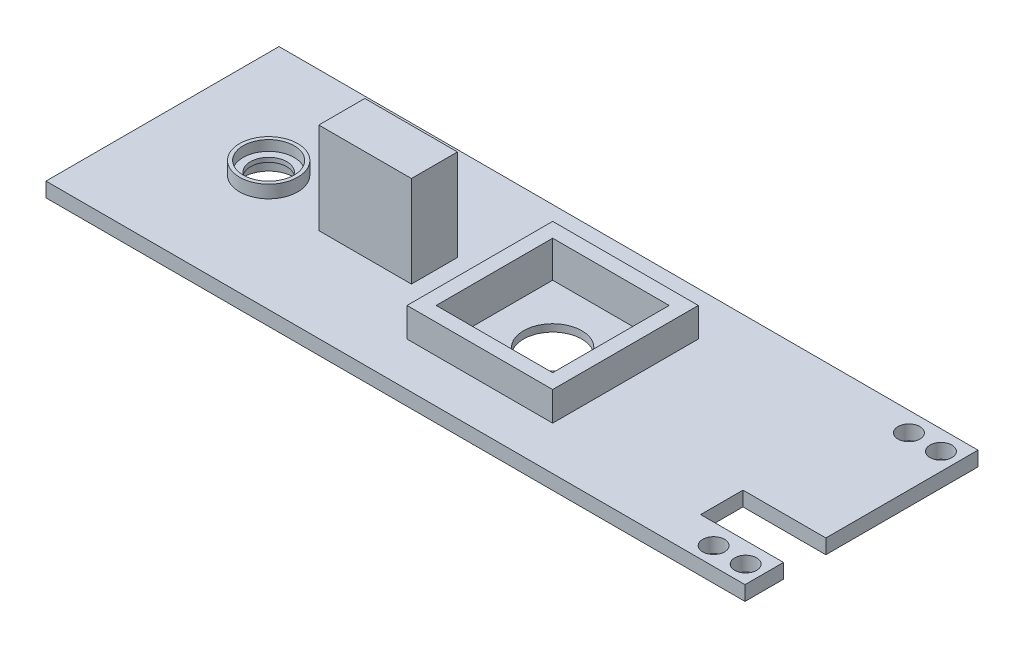
ISO-10303-21;
HEADER;
FILE_DESCRIPTION(('STEP AP214'),'2;1');
FILE_NAME('part.step','',(''),(''),'','','');
FILE_SCHEMA(('AUTOMOTIVE_DESIGN { 1 0 10303 214 1 1 1 1 }'));
ENDSEC;
DATA;
#1=APPLICATION_CONTEXT('core data for automotive mechanical design processes');
#2=APPLICATION_PROTOCOL_DEFINITION('international standard','automotive_design',2000,#1);
#3=PRODUCT_CONTEXT('',#1,'mechanical');
#4=PRODUCT('Part','Part','',(#3));
#5=PRODUCT_RELATED_PRODUCT_CATEGORY('part','',(#4));
#6=PRODUCT_DEFINITION_FORMATION('','',#4);
#7=PRODUCT_DEFINITION_CONTEXT('part definition',#1,'design');
#8=PRODUCT_DEFINITION('design','',#6,#7);
#9=PRODUCT_DEFINITION_SHAPE('','',#8);
#10=(LENGTH_UNIT() NAMED_UNIT(*) SI_UNIT(.MILLI.,.METRE.));
#11=(NAMED_UNIT(*) PLANE_ANGLE_UNIT() SI_UNIT($,.RADIAN.));
#12=(NAMED_UNIT(*) SI_UNIT($,.STERADIAN.) SOLID_ANGLE_UNIT());
#13=UNCERTAINTY_MEASURE_WITH_UNIT(LENGTH_MEASURE(1.E-05),#10,'distance_accuracy_value','');
#14=(GEOMETRIC_REPRESENTATION_CONTEXT(3) GLOBAL_UNCERTAINTY_ASSIGNED_CONTEXT((#13)) GLOBAL_UNIT_ASSIGNED_CONTEXT((#10,
#11,#12)) REPRESENTATION_CONTEXT('',''));
#15=CARTESIAN_POINT('',(0.,0.,0.));
#16=DIRECTION('',(0.,0.,1.));
#17=DIRECTION('',(1.,0.,0.));
#18=AXIS2_PLACEMENT_3D('',#15,#16,#17);
#19=CARTESIAN_POINT('',(0.,6.35,50.8));
#20=DIRECTION('',(-1.,0.,0.));
#21=DIRECTION('',(0.,0.,1.));
#22=AXIS2_PLACEMENT_3D('',#19,#20,#21);
#23=PLANE('',#22);
#24=DIRECTION('',(0.,0.,-1.));
#25=VECTOR('',#24,1.);
#26=CARTESIAN_POINT('',(0.,0.,50.8));
#27=LINE('',#26,#25);
#28=CARTESIAN_POINT('',(0.,0.,50.8));
#29=VERTEX_POINT('',#28);
#30=CARTESIAN_POINT('',(0.,0.,34.012825548));
#31=VERTEX_POINT('',#30);
#32=EDGE_CURVE('E207',#29,#31,#27,.T.);
#33=ORIENTED_EDGE('',*,*,#32,.T.);
#34=DIRECTION('',(0.,1.,0.));
#35=VECTOR('',#34,1.);
#36=CARTESIAN_POINT('',(0.,0.,34.012825548));
#37=LINE('',#36,#35);
#38=CARTESIAN_POINT('',(0.,6.35,34.012825548));
#39=VERTEX_POINT('',#38);
#40=EDGE_CURVE('E298',#31,#39,#37,.T.);
#41=ORIENTED_EDGE('',*,*,#40,.T.);
#42=DIRECTION('',(0.,0.,-1.));
#43=VECTOR('',#42,1.);
#44=CARTESIAN_POINT('',(0.,6.35,50.8));
#45=LINE('',#44,#43);
#46=CARTESIAN_POINT('',(0.,6.35,50.8));
#47=VERTEX_POINT('',#46);
#48=EDGE_CURVE('E274',#47,#39,#45,.T.);
#49=ORIENTED_EDGE('',*,*,#48,.F.);
#50=DIRECTION('',(0.,-1.,0.));
#51=VECTOR('',#50,1.);
#52=CARTESIAN_POINT('',(0.,6.35,50.8));
#53=LINE('',#52,#51);
#54=EDGE_CURVE('E228',#47,#29,#53,.T.);
#55=ORIENTED_EDGE('',*,*,#54,.T.);
#56=EDGE_LOOP('',(#33,#41,#49,#55));
#57=FACE_BOUND('',#56,.T.);
#58=ADVANCED_FACE('F40',(#57),#23,.F.);
#59=CARTESIAN_POINT('',(-134.66620377136,0.,0.));
#60=DIRECTION('',(0.,1.,0.));
#61=DIRECTION('',(0.,0.,1.));
#62=AXIS2_PLACEMENT_3D('',#59,#60,#61);
#63=CYLINDRICAL_SURFACE('',#62,12.7);
#64=CARTESIAN_POINT('',(-134.66620377136,0.,0.));
#65=DIRECTION('',(0.,1.,0.));
#66=DIRECTION('',(0.,0.,1.));
#67=AXIS2_PLACEMENT_3D('',#64,#65,#66);
#68=CIRCLE('',#67,12.7);
#69=CARTESIAN_POINT('',(-134.66620377136,0.,12.7));
#70=VERTEX_POINT('',#69);
#71=EDGE_CURVE('E254',#70,#70,#68,.T.);
#72=ORIENTED_EDGE('',*,*,#71,.F.);
#73=EDGE_LOOP('',(#72));
#74=FACE_BOUND('',#73,.T.);
#75=CARTESIAN_POINT('',(-134.66620377136,3.175,0.));
#76=DIRECTION('',(0.,1.,0.));
#77=DIRECTION('',(0.,0.,1.));
#78=AXIS2_PLACEMENT_3D('',#75,#76,#77);
#79=CIRCLE('',#78,12.7);
#80=CARTESIAN_POINT('',(-134.66620377136,3.175,12.7));
#81=VERTEX_POINT('',#80);
#82=EDGE_CURVE('E44',#81,#81,#79,.F.);
#83=ORIENTED_EDGE('',*,*,#82,.F.);
#84=EDGE_LOOP('',(#83));
#85=FACE_BOUND('',#84,.T.);
#86=ADVANCED_FACE('F504',(#74,#85),#63,.F.);
#87=CARTESIAN_POINT('',(0.,6.35,0.));
#88=DIRECTION('',(0.,-1.,0.));
#89=DIRECTION('',(0.,0.,-1.));
#90=AXIS2_PLACEMENT_3D('',#87,#88,#89);
#91=PLANE('',#90);
#92=CARTESIAN_POINT('',(-21.5900000000001,6.35,42.8937735394044));
#93=DIRECTION('',(0.,1.,0.));
#94=DIRECTION('',(0.,0.,1.));
#95=AXIS2_PLACEMENT_3D('',#92,#93,#94);
#96=CIRCLE('',#95,4.7625);
#97=CARTESIAN_POINT('',(-21.5900000000001,6.35,47.6562735394044));
#98=VERTEX_POINT('',#97);
#99=EDGE_CURVE('E325',#98,#98,#96,.T.);
#100=ORIENTED_EDGE('',*,*,#99,.F.);
#101=EDGE_LOOP('',(#100));
#102=FACE_BOUND('',#101,.T.);
#103=CARTESIAN_POINT('',(-7.62000000000005,6.35,-42.2729419728967));
#104=DIRECTION('',(0.,1.,0.));
#105=DIRECTION('',(0.,0.,1.));
#106=AXIS2_PLACEMENT_3D('',#103,#104,#105);
#107=CIRCLE('',#106,4.7625);
#108=CARTESIAN_POINT('',(-7.62000000000005,6.35,-37.5104419728967));
#109=VERTEX_POINT('',#108);
#110=EDGE_CURVE('E318',#109,#109,#107,.T.);
#111=ORIENTED_EDGE('',*,*,#110,.F.);
#112=EDGE_LOOP('',(#111));
#113=FACE_BOUND('',#112,.T.);
#114=CARTESIAN_POINT('',(-21.5900000000001,6.35,-42.2729419728967));
#115=DIRECTION('',(0.,1.,0.));
#116=DIRECTION('',(0.,0.,1.));
#117=AXIS2_PLACEMENT_3D('',#114,#115,#116);
#118=CIRCLE('',#117,4.7625);
#119=CARTESIAN_POINT('',(-21.5900000000001,6.35,-37.5104419728967));
#120=VERTEX_POINT('',#119);
#121=EDGE_CURVE('E302',#120,#120,#118,.T.);
#122=ORIENTED_EDGE('',*,*,#121,.F.);
#123=EDGE_LOOP('',(#122));
#124=FACE_BOUND('',#123,.T.);
#125=CARTESIAN_POINT('',(-7.62000000000005,6.35,42.8937735394044));
#126=DIRECTION('',(0.,1.,0.));
#127=DIRECTION('',(0.,0.,1.));
#128=AXIS2_PLACEMENT_3D('',#125,#126,#127);
#129=CIRCLE('',#128,4.7625);
#130=CARTESIAN_POINT('',(-7.62000000000005,6.35,47.6562735394044));
#131=VERTEX_POINT('',#130);
#132=EDGE_CURVE('E324',#131,#131,#129,.T.);
#133=ORIENTED_EDGE('',*,*,#132,.F.);
#134=EDGE_LOOP('',(#133));
#135=FACE_BOUND('',#134,.T.);
#136=DIRECTION('',(0.,0.,-1.));
#137=VECTOR('',#136,1.);
#138=CARTESIAN_POINT('',(-226.61201316896,6.35,10.033));
#139=LINE('',#138,#137);
#140=CARTESIAN_POINT('',(-226.61201316896,6.35,10.033));
#141=VERTEX_POINT('',#140);
#142=CARTESIAN_POINT('',(-226.61201316896,6.35,-10.033));
#143=VERTEX_POINT('',#142);
#144=EDGE_CURVE('E66',#141,#143,#139,.T.);
#145=ORIENTED_EDGE('',*,*,#144,.T.);
#146=DIRECTION('',(1.,0.,0.));
#147=VECTOR('',#146,1.);
#148=CARTESIAN_POINT('',(-226.61201316896,6.35,-10.033));
#149=LINE('',#148,#147);
#150=CARTESIAN_POINT('',(-186.22601316896,6.35,-10.033));
#151=VERTEX_POINT('',#150);
#152=EDGE_CURVE('E340',#143,#151,#149,.T.);
#153=ORIENTED_EDGE('',*,*,#152,.T.);
#154=DIRECTION('',(0.,0.,-1.));
#155=VECTOR('',#154,1.);
#156=CARTESIAN_POINT('',(-186.22601316896,6.35,10.033));
#157=LINE('',#156,#155);
#158=CARTESIAN_POINT('',(-186.22601316896,6.35,10.033));
#159=VERTEX_POINT('',#158);
#160=EDGE_CURVE('E361',#159,#151,#157,.T.);
#161=ORIENTED_EDGE('',*,*,#160,.F.);
#162=DIRECTION('',(1.,0.,0.));
#163=VECTOR('',#162,1.);
#164=CARTESIAN_POINT('',(-226.61201316896,6.35,10.033));
#165=LINE('',#164,#163);
#166=EDGE_CURVE('E365',#141,#159,#165,.T.);
#167=ORIENTED_EDGE('',*,*,#166,.F.);
#168=EDGE_LOOP('',(#145,#153,#161,#167));
#169=FACE_BOUND('',#168,.T.);
#170=ORIENTED_EDGE('',*,*,#48,.T.);
#171=DIRECTION('',(1.,0.,0.));
#172=VECTOR('',#171,1.);
#173=CARTESIAN_POINT('',(0.,6.35,34.012825548));
#174=LINE('',#173,#172);
#175=CARTESIAN_POINT('',(-36.1330886015093,6.35,34.012825548));
#176=VERTEX_POINT('',#175);
#177=EDGE_CURVE('E189',#176,#39,#174,.T.);
#178=ORIENTED_EDGE('',*,*,#177,.F.);
#179=DIRECTION('',(0.,0.,1.));
#180=VECTOR('',#179,1.);
#181=CARTESIAN_POINT('',(-36.1330886015093,6.35,15.542574452));
#182=LINE('',#181,#180);
#183=CARTESIAN_POINT('',(-36.1330886015093,6.35,15.542574452));
#184=VERTEX_POINT('',#183);
#185=EDGE_CURVE('E545',#184,#176,#182,.T.);
#186=ORIENTED_EDGE('',*,*,#185,.F.);
#187=DIRECTION('',(-1.,0.,0.));
#188=VECTOR('',#187,1.);
#189=CARTESIAN_POINT('',(0.,6.35,15.542574452));
#190=LINE('',#189,#188);
#191=CARTESIAN_POINT('',(0.,6.35,15.542574452));
#192=VERTEX_POINT('',#191);
#193=EDGE_CURVE('E543',#192,#184,#190,.T.);
#194=ORIENTED_EDGE('',*,*,#193,.F.);
#195=CARTESIAN_POINT('',(0.,6.35,-50.8));
#196=VERTEX_POINT('',#195);
#197=EDGE_CURVE('E196',#192,#196,#45,.T.);
#198=ORIENTED_EDGE('',*,*,#197,.T.);
#199=DIRECTION('',(-1.,0.,0.));
#200=VECTOR('',#199,1.);
#201=CARTESIAN_POINT('',(-304.8,6.35,-50.8));
#202=LINE('',#201,#200);
#203=CARTESIAN_POINT('',(-304.8,6.35,-50.8));
#204=VERTEX_POINT('',#203);
#205=EDGE_CURVE('E278',#196,#204,#202,.T.);
#206=ORIENTED_EDGE('',*,*,#205,.T.);
#207=DIRECTION('',(0.,0.,1.));
#208=VECTOR('',#207,1.);
#209=CARTESIAN_POINT('',(-304.8,6.35,50.8));
#210=LINE('',#209,#208);
#211=CARTESIAN_POINT('',(-304.8,6.35,50.8));
#212=VERTEX_POINT('',#211);
#213=EDGE_CURVE('E280',#204,#212,#210,.T.);
#214=ORIENTED_EDGE('',*,*,#213,.T.);
#215=DIRECTION('',(1.,0.,0.));
#216=VECTOR('',#215,1.);
#217=CARTESIAN_POINT('',(-304.8,6.35,50.8));
#218=LINE('',#217,#216);
#219=EDGE_CURVE('E218',#212,#47,#218,.T.);
#220=ORIENTED_EDGE('',*,*,#219,.T.);
#221=EDGE_LOOP('',(#170,#178,#186,#194,#198,#206,#214,#220));
#222=FACE_BOUND('',#221,.T.);
#223=CARTESIAN_POINT('',(-258.510557856653,6.35,0.));
#224=DIRECTION('',(0.,-1.,0.));
#225=DIRECTION('',(0.,0.,-1.));
#226=AXIS2_PLACEMENT_3D('',#223,#224,#225);
#227=CIRCLE('',#226,12.7);
#228=CARTESIAN_POINT('',(-258.510557856653,6.35,-12.7));
#229=VERTEX_POINT('',#228);
#230=EDGE_CURVE('E11',#229,#229,#227,.F.);
#231=ORIENTED_EDGE('',*,*,#230,.F.);
#232=EDGE_LOOP('',(#231));
#233=FACE_BOUND('',#232,.T.);
#234=DIRECTION('',(0.,0.,1.));
#235=VECTOR('',#234,1.);
#236=CARTESIAN_POINT('',(-166.41620377136,6.35,31.75));
#237=LINE('',#236,#235);
#238=CARTESIAN_POINT('',(-166.41620377136,6.35,-31.75));
#239=VERTEX_POINT('',#238);
#240=CARTESIAN_POINT('',(-166.41620377136,6.35,31.75));
#241=VERTEX_POINT('',#240);
#242=EDGE_CURVE('E444',#239,#241,#237,.T.);
#243=ORIENTED_EDGE('',*,*,#242,.F.);
#244=DIRECTION('',(-1.,0.,0.));
#245=VECTOR('',#244,1.);
#246=CARTESIAN_POINT('',(-102.91620377136,6.35,-31.75));
#247=LINE('',#246,#245);
#248=CARTESIAN_POINT('',(-102.91620377136,6.35,-31.75));
#249=VERTEX_POINT('',#248);
#250=EDGE_CURVE('E434',#249,#239,#247,.T.);
#251=ORIENTED_EDGE('',*,*,#250,.F.);
#252=DIRECTION('',(0.,0.,-1.));
#253=VECTOR('',#252,1.);
#254=CARTESIAN_POINT('',(-102.91620377136,6.35,31.75));
#255=LINE('',#254,#253);
#256=CARTESIAN_POINT('',(-102.91620377136,6.35,31.75));
#257=VERTEX_POINT('',#256);
#258=EDGE_CURVE('E452',#257,#249,#255,.T.);
#259=ORIENTED_EDGE('',*,*,#258,.F.);
#260=DIRECTION('',(1.,0.,0.));
#261=VECTOR('',#260,1.);
#262=CARTESIAN_POINT('',(-102.91620377136,6.35,31.75));
#263=LINE('',#262,#261);
#264=EDGE_CURVE('E448',#241,#257,#263,.T.);
#265=ORIENTED_EDGE('',*,*,#264,.F.);
#266=EDGE_LOOP('',(#243,#251,#259,#265));
#267=FACE_BOUND('',#266,.T.);
#268=ADVANCED_FACE('F288',(#102,#113,#124,#135,#169,#222,#233,#267),#91,.F.);
#269=ORIENTED_EDGE('',*,*,#197,.F.);
#270=DIRECTION('',(0.,1.,0.));
#271=VECTOR('',#270,1.);
#272=CARTESIAN_POINT('',(0.,0.,15.542574452));
#273=LINE('',#272,#271);
#274=CARTESIAN_POINT('',(0.,0.,15.542574452));
#275=VERTEX_POINT('',#274);
#276=EDGE_CURVE('E183',#275,#192,#273,.T.);
#277=ORIENTED_EDGE('',*,*,#276,.F.);
#278=CARTESIAN_POINT('',(0.,0.,-50.8));
#279=VERTEX_POINT('',#278);
#280=EDGE_CURVE('E194',#275,#279,#27,.T.);
#281=ORIENTED_EDGE('',*,*,#280,.T.);
#282=DIRECTION('',(0.,-1.,0.));
#283=VECTOR('',#282,1.);
#284=CARTESIAN_POINT('',(0.,6.35,-50.8));
#285=LINE('',#284,#283);
#286=EDGE_CURVE('E50',#196,#279,#285,.T.);
#287=ORIENTED_EDGE('',*,*,#286,.F.);
#288=EDGE_LOOP('',(#269,#277,#281,#287));
#289=FACE_BOUND('',#288,.T.);
#290=ADVANCED_FACE('F42',(#289),#23,.F.);
#291=CARTESIAN_POINT('',(-304.8,6.35,-50.8));
#292=DIRECTION('',(0.,0.,1.));
#293=DIRECTION('',(1.,0.,0.));
#294=AXIS2_PLACEMENT_3D('',#291,#292,#293);
#295=PLANE('',#294);
#296=DIRECTION('',(-1.,0.,0.));
#297=VECTOR('',#296,1.);
#298=CARTESIAN_POINT('',(-304.8,0.,-50.8));
#299=LINE('',#298,#297);
#300=CARTESIAN_POINT('',(-304.8,0.,-50.8));
#301=VERTEX_POINT('',#300);
#302=EDGE_CURVE('E204',#279,#301,#299,.T.);
#303=ORIENTED_EDGE('',*,*,#302,.T.);
#304=DIRECTION('',(0.,-1.,0.));
#305=VECTOR('',#304,1.);
#306=CARTESIAN_POINT('',(-304.8,6.35,-50.8));
#307=LINE('',#306,#305);
#308=EDGE_CURVE('E236',#204,#301,#307,.T.);
#309=ORIENTED_EDGE('',*,*,#308,.F.);
#310=ORIENTED_EDGE('',*,*,#205,.F.);
#311=ORIENTED_EDGE('',*,*,#286,.T.);
#312=EDGE_LOOP('',(#303,#309,#310,#311));
#313=FACE_BOUND('',#312,.T.);
#314=ADVANCED_FACE('F513',(#313),#295,.F.);
#315=CARTESIAN_POINT('',(-304.8,6.35,50.8));
#316=DIRECTION('',(1.,0.,0.));
#317=DIRECTION('',(0.,0.,-1.));
#318=AXIS2_PLACEMENT_3D('',#315,#316,#317);
#319=PLANE('',#318);
#320=DIRECTION('',(0.,0.,1.));
#321=VECTOR('',#320,1.);
#322=CARTESIAN_POINT('',(-304.8,0.,50.8));
#323=LINE('',#322,#321);
#324=CARTESIAN_POINT('',(-304.8,0.,50.8));
#325=VERTEX_POINT('',#324);
#326=EDGE_CURVE('E222',#301,#325,#323,.T.);
#327=ORIENTED_EDGE('',*,*,#326,.T.);
#328=DIRECTION('',(0.,-1.,0.));
#329=VECTOR('',#328,1.);
#330=CARTESIAN_POINT('',(-304.8,6.35,50.8));
#331=LINE('',#330,#329);
#332=EDGE_CURVE('E232',#212,#325,#331,.T.);
#333=ORIENTED_EDGE('',*,*,#332,.F.);
#334=ORIENTED_EDGE('',*,*,#213,.F.);
#335=ORIENTED_EDGE('',*,*,#308,.T.);
#336=EDGE_LOOP('',(#327,#333,#334,#335));
#337=FACE_BOUND('',#336,.T.);
#338=ADVANCED_FACE('F518',(#337),#319,.F.);
#339=CARTESIAN_POINT('',(-304.8,6.35,50.8));
#340=DIRECTION('',(0.,0.,-1.));
#341=DIRECTION('',(-1.,0.,0.));
#342=AXIS2_PLACEMENT_3D('',#339,#340,#341);
#343=PLANE('',#342);
#344=DIRECTION('',(1.,0.,0.));
#345=VECTOR('',#344,1.);
#346=CARTESIAN_POINT('',(-304.8,0.,50.8));
#347=LINE('',#346,#345);
#348=EDGE_CURVE('E225',#325,#29,#347,.T.);
#349=ORIENTED_EDGE('',*,*,#348,.T.);
#350=ORIENTED_EDGE('',*,*,#54,.F.);
#351=ORIENTED_EDGE('',*,*,#219,.F.);
#352=ORIENTED_EDGE('',*,*,#332,.T.);
#353=EDGE_LOOP('',(#349,#350,#351,#352));
#354=FACE_BOUND('',#353,.T.);
#355=ADVANCED_FACE('F293',(#354),#343,.F.);
#356=CARTESIAN_POINT('',(0.,0.,0.));
#357=DIRECTION('',(0.,-1.,0.));
#358=DIRECTION('',(0.,0.,-1.));
#359=AXIS2_PLACEMENT_3D('',#356,#357,#358);
#360=PLANE('',#359);
#361=DIRECTION('',(1.,0.,0.));
#362=VECTOR('',#361,1.);
#363=CARTESIAN_POINT('',(0.,0.,34.012825548));
#364=LINE('',#363,#362);
#365=CARTESIAN_POINT('',(-36.1330886015093,0.,34.012825548));
#366=VERTEX_POINT('',#365);
#367=EDGE_CURVE('E198',#366,#31,#364,.T.);
#368=ORIENTED_EDGE('',*,*,#367,.T.);
#369=ORIENTED_EDGE('',*,*,#32,.F.);
#370=ORIENTED_EDGE('',*,*,#348,.F.);
#371=ORIENTED_EDGE('',*,*,#326,.F.);
#372=ORIENTED_EDGE('',*,*,#302,.F.);
#373=ORIENTED_EDGE('',*,*,#280,.F.);
#374=DIRECTION('',(-1.,0.,0.));
#375=VECTOR('',#374,1.);
#376=CARTESIAN_POINT('',(0.,0.,15.542574452));
#377=LINE('',#376,#375);
#378=CARTESIAN_POINT('',(-36.1330886015093,0.,15.542574452));
#379=VERTEX_POINT('',#378);
#380=EDGE_CURVE('E179',#275,#379,#377,.T.);
#381=ORIENTED_EDGE('',*,*,#380,.T.);
#382=DIRECTION('',(0.,0.,1.));
#383=VECTOR('',#382,1.);
#384=CARTESIAN_POINT('',(-36.1330886015093,0.,15.542574452));
#385=LINE('',#384,#383);
#386=EDGE_CURVE('E58',#379,#366,#385,.T.);
#387=ORIENTED_EDGE('',*,*,#386,.T.);
#388=EDGE_LOOP('',(#368,#369,#370,#371,#372,#373,#381,#387));
#389=FACE_BOUND('',#388,.T.);
#390=CARTESIAN_POINT('',(-21.5900000000001,0.,42.8937735394044));
#391=DIRECTION('',(0.,1.,0.));
#392=DIRECTION('',(0.,0.,1.));
#393=AXIS2_PLACEMENT_3D('',#390,#391,#392);
#394=CIRCLE('',#393,4.7625);
#395=CARTESIAN_POINT('',(-21.5900000000001,0.,47.6562735394044));
#396=VERTEX_POINT('',#395);
#397=EDGE_CURVE('E320',#396,#396,#394,.T.);
#398=ORIENTED_EDGE('',*,*,#397,.T.);
#399=EDGE_LOOP('',(#398));
#400=FACE_BOUND('',#399,.T.);
#401=CARTESIAN_POINT('',(-7.62000000000005,0.,-42.2729419728967));
#402=DIRECTION('',(0.,1.,0.));
#403=DIRECTION('',(0.,0.,1.));
#404=AXIS2_PLACEMENT_3D('',#401,#402,#403);
#405=CIRCLE('',#404,4.7625);
#406=CARTESIAN_POINT('',(-7.62000000000005,0.,-37.5104419728967));
#407=VERTEX_POINT('',#406);
#408=EDGE_CURVE('E329',#407,#407,#405,.T.);
#409=ORIENTED_EDGE('',*,*,#408,.T.);
#410=EDGE_LOOP('',(#409));
#411=FACE_BOUND('',#410,.T.);
#412=CARTESIAN_POINT('',(-21.5900000000001,0.,-42.2729419728967));
#413=DIRECTION('',(0.,1.,0.));
#414=DIRECTION('',(0.,0.,1.));
#415=AXIS2_PLACEMENT_3D('',#412,#413,#414);
#416=CIRCLE('',#415,4.7625);
#417=CARTESIAN_POINT('',(-21.5900000000001,0.,-37.5104419728967));
#418=VERTEX_POINT('',#417);
#419=EDGE_CURVE('E308',#418,#418,#416,.T.);
#420=ORIENTED_EDGE('',*,*,#419,.T.);
#421=EDGE_LOOP('',(#420));
#422=FACE_BOUND('',#421,.T.);
#423=CARTESIAN_POINT('',(-7.62000000000005,0.,42.8937735394044));
#424=DIRECTION('',(0.,1.,0.));
#425=DIRECTION('',(0.,0.,1.));
#426=AXIS2_PLACEMENT_3D('',#423,#424,#425);
#427=CIRCLE('',#426,4.7625);
#428=CARTESIAN_POINT('',(-7.62000000000005,0.,47.6562735394044));
#429=VERTEX_POINT('',#428);
#430=EDGE_CURVE('E336',#429,#429,#427,.T.);
#431=ORIENTED_EDGE('',*,*,#430,.T.);
#432=EDGE_LOOP('',(#431));
#433=FACE_BOUND('',#432,.T.);
#434=ORIENTED_EDGE('',*,*,#71,.T.);
#435=EDGE_LOOP('',(#434));
#436=FACE_BOUND('',#435,.T.);
#437=CARTESIAN_POINT('',(-258.510557856653,0.,0.));
#438=DIRECTION('',(0.,-1.,0.));
#439=DIRECTION('',(0.,0.,-1.));
#440=AXIS2_PLACEMENT_3D('',#437,#438,#439);
#441=CIRCLE('',#440,11.1125);
#442=CARTESIAN_POINT('',(-258.510557856653,0.,-11.1125));
#443=VERTEX_POINT('',#442);
#444=EDGE_CURVE('E244',#443,#443,#441,.T.);
#445=ORIENTED_EDGE('',*,*,#444,.F.);
#446=EDGE_LOOP('',(#445));
#447=FACE_BOUND('',#446,.T.);
#448=ADVANCED_FACE('F201',(#389,#400,#411,#422,#433,#436,#447),#360,.T.);
#449=CARTESIAN_POINT('',(-258.510557856653,11.90625,0.));
#450=DIRECTION('',(0.,-1.,0.));
#451=DIRECTION('',(0.,0.,-1.));
#452=AXIS2_PLACEMENT_3D('',#449,#450,#451);
#453=CYLINDRICAL_SURFACE('',#452,12.7);
#454=CARTESIAN_POINT('',(-258.510557856653,11.90625,0.));
#455=DIRECTION('',(0.,1.,0.));
#456=DIRECTION('',(0.,0.,1.));
#457=AXIS2_PLACEMENT_3D('',#454,#455,#456);
#458=CIRCLE('',#457,12.7);
#459=CARTESIAN_POINT('',(-258.510557856653,11.90625,12.7));
#460=VERTEX_POINT('',#459);
#461=EDGE_CURVE('E208',#460,#460,#458,.T.);
#462=ORIENTED_EDGE('',*,*,#461,.F.);
#463=EDGE_LOOP('',(#462));
#464=FACE_BOUND('',#463,.T.);
#465=ORIENTED_EDGE('',*,*,#230,.T.);
#466=EDGE_LOOP('',(#465));
#467=FACE_BOUND('',#466,.T.);
#468=ADVANCED_FACE('F528',(#464,#467),#453,.T.);
#469=CARTESIAN_POINT('',(-258.510557856653,11.90625,0.));
#470=DIRECTION('',(0.,1.,0.));
#471=DIRECTION('',(0.,0.,1.));
#472=AXIS2_PLACEMENT_3D('',#469,#470,#471);
#473=PLANE('',#472);
#474=CARTESIAN_POINT('',(-258.510557856653,11.90625,0.));
#475=DIRECTION('',(0.,1.,0.));
#476=DIRECTION('',(0.,0.,1.));
#477=AXIS2_PLACEMENT_3D('',#474,#475,#476);
#478=CIRCLE('',#477,11.1125);
#479=CARTESIAN_POINT('',(-258.510557856653,11.90625,11.1125));
#480=VERTEX_POINT('',#479);
#481=EDGE_CURVE('E266',#480,#480,#478,.T.);
#482=ORIENTED_EDGE('',*,*,#481,.F.);
#483=EDGE_LOOP('',(#482));
#484=FACE_BOUND('',#483,.T.);
#485=ORIENTED_EDGE('',*,*,#461,.T.);
#486=EDGE_LOOP('',(#485));
#487=FACE_BOUND('',#486,.T.);
#488=ADVANCED_FACE('F711',(#484,#487),#473,.T.);
#489=CARTESIAN_POINT('',(-258.510557856653,7.46125,0.));
#490=DIRECTION('',(0.,1.,0.));
#491=DIRECTION('',(0.,0.,1.));
#492=AXIS2_PLACEMENT_3D('',#489,#490,#491);
#493=CYLINDRICAL_SURFACE('',#492,11.1125);
#494=CARTESIAN_POINT('',(-258.510557856653,7.46125,0.));
#495=DIRECTION('',(0.,1.,0.));
#496=DIRECTION('',(0.,0.,1.));
#497=AXIS2_PLACEMENT_3D('',#494,#495,#496);
#498=CIRCLE('',#497,11.1125);
#499=CARTESIAN_POINT('',(-258.510557856653,7.46125,11.1125));
#500=VERTEX_POINT('',#499);
#501=EDGE_CURVE('E214',#500,#500,#498,.T.);
#502=ORIENTED_EDGE('',*,*,#501,.F.);
#503=EDGE_LOOP('',(#502));
#504=FACE_BOUND('',#503,.T.);
#505=ORIENTED_EDGE('',*,*,#481,.T.);
#506=EDGE_LOOP('',(#505));
#507=FACE_BOUND('',#506,.T.);
#508=ADVANCED_FACE('F717',(#504,#507),#493,.F.);
#509=CARTESIAN_POINT('',(-258.510557856653,7.46125,0.));
#510=DIRECTION('',(0.,1.,0.));
#511=DIRECTION('',(0.,0.,1.));
#512=AXIS2_PLACEMENT_3D('',#509,#510,#511);
#513=PLANE('',#512);
#514=CARTESIAN_POINT('',(-258.510557856653,7.46125,0.));
#515=DIRECTION('',(0.,1.,0.));
#516=DIRECTION('',(0.,0.,1.));
#517=AXIS2_PLACEMENT_3D('',#514,#515,#516);
#518=CIRCLE('',#517,7.93749999999998);
#519=CARTESIAN_POINT('',(-258.510557856653,7.46125,7.93749999999998));
#520=VERTEX_POINT('',#519);
#521=EDGE_CURVE('E245',#520,#520,#518,.T.);
#522=ORIENTED_EDGE('',*,*,#521,.F.);
#523=EDGE_LOOP('',(#522));
#524=FACE_BOUND('',#523,.T.);
#525=ORIENTED_EDGE('',*,*,#501,.T.);
#526=EDGE_LOOP('',(#525));
#527=FACE_BOUND('',#526,.T.);
#528=ADVANCED_FACE('F724',(#524,#527),#513,.T.);
#529=CARTESIAN_POINT('',(-258.510557856653,5.55625,0.));
#530=DIRECTION('',(0.,-1.,0.));
#531=DIRECTION('',(0.,0.,-1.));
#532=AXIS2_PLACEMENT_3D('',#529,#530,#531);
#533=CYLINDRICAL_SURFACE('',#532,11.1125);
#534=CARTESIAN_POINT('',(-258.510557856653,5.55625,0.));
#535=DIRECTION('',(0.,-1.,0.));
#536=DIRECTION('',(0.,0.,-1.));
#537=AXIS2_PLACEMENT_3D('',#534,#535,#536);
#538=CIRCLE('',#537,11.1125);
#539=CARTESIAN_POINT('',(-258.510557856653,5.55625,-11.1125));
#540=VERTEX_POINT('',#539);
#541=EDGE_CURVE('E251',#540,#540,#538,.T.);
#542=ORIENTED_EDGE('',*,*,#541,.F.);
#543=EDGE_LOOP('',(#542));
#544=FACE_BOUND('',#543,.T.);
#545=ORIENTED_EDGE('',*,*,#444,.T.);
#546=EDGE_LOOP('',(#545));
#547=FACE_BOUND('',#546,.T.);
#548=ADVANCED_FACE('F733',(#544,#547),#533,.F.);
#549=CARTESIAN_POINT('',(-258.510557856653,5.55625,0.));
#550=DIRECTION('',(0.,-1.,0.));
#551=DIRECTION('',(0.,0.,-1.));
#552=AXIS2_PLACEMENT_3D('',#549,#550,#551);
#553=PLANE('',#552);
#554=CARTESIAN_POINT('',(-258.510557856653,5.55625,0.));
#555=DIRECTION('',(0.,-1.,0.));
#556=DIRECTION('',(0.,0.,-1.));
#557=AXIS2_PLACEMENT_3D('',#554,#555,#556);
#558=CIRCLE('',#557,7.93749999999998);
#559=CARTESIAN_POINT('',(-258.510557856653,5.55625,-7.93749999999998));
#560=VERTEX_POINT('',#559);
#561=EDGE_CURVE('E241',#560,#560,#558,.T.);
#562=ORIENTED_EDGE('',*,*,#561,.F.);
#563=EDGE_LOOP('',(#562));
#564=FACE_BOUND('',#563,.T.);
#565=ORIENTED_EDGE('',*,*,#541,.T.);
#566=EDGE_LOOP('',(#565));
#567=FACE_BOUND('',#566,.T.);
#568=ADVANCED_FACE('F741',(#564,#567),#553,.T.);
#569=CARTESIAN_POINT('',(-258.510557856653,0.,0.));
#570=DIRECTION('',(0.,1.,0.));
#571=DIRECTION('',(0.,0.,1.));
#572=AXIS2_PLACEMENT_3D('',#569,#570,#571);
#573=CYLINDRICAL_SURFACE('',#572,7.93749999999998);
#574=ORIENTED_EDGE('',*,*,#561,.T.);
#575=EDGE_LOOP('',(#574));
#576=FACE_BOUND('',#575,.T.);
#577=ORIENTED_EDGE('',*,*,#521,.T.);
#578=EDGE_LOOP('',(#577));
#579=FACE_BOUND('',#578,.T.);
#580=ADVANCED_FACE('F748',(#576,#579),#573,.F.);
#581=CARTESIAN_POINT('',(-166.41620377136,19.05,31.75));
#582=DIRECTION('',(1.,0.,0.));
#583=DIRECTION('',(0.,0.,-1.));
#584=AXIS2_PLACEMENT_3D('',#581,#582,#583);
#585=PLANE('',#584);
#586=ORIENTED_EDGE('',*,*,#242,.T.);
#587=DIRECTION('',(0.,-1.,0.));
#588=VECTOR('',#587,1.);
#589=CARTESIAN_POINT('',(-166.41620377136,19.05,31.75));
#590=LINE('',#589,#588);
#591=CARTESIAN_POINT('',(-166.41620377136,19.05,31.75));
#592=VERTEX_POINT('',#591);
#593=EDGE_CURVE('E260',#592,#241,#590,.T.);
#594=ORIENTED_EDGE('',*,*,#593,.F.);
#595=DIRECTION('',(0.,0.,1.));
#596=VECTOR('',#595,1.);
#597=CARTESIAN_POINT('',(-166.41620377136,19.05,31.75));
#598=LINE('',#597,#596);
#599=CARTESIAN_POINT('',(-166.41620377136,19.05,-31.75));
#600=VERTEX_POINT('',#599);
#601=EDGE_CURVE('E429',#600,#592,#598,.T.);
#602=ORIENTED_EDGE('',*,*,#601,.F.);
#603=DIRECTION('',(0.,-1.,0.));
#604=VECTOR('',#603,1.);
#605=CARTESIAN_POINT('',(-166.41620377136,19.05,-31.75));
#606=LINE('',#605,#604);
#607=EDGE_CURVE('E443',#600,#239,#606,.T.);
#608=ORIENTED_EDGE('',*,*,#607,.T.);
#609=EDGE_LOOP('',(#586,#594,#602,#608));
#610=FACE_BOUND('',#609,.T.);
#611=ADVANCED_FACE('F477',(#610),#585,.F.);
#612=CARTESIAN_POINT('',(-102.91620377136,19.05,31.75));
#613=DIRECTION('',(0.,0.,-1.));
#614=DIRECTION('',(-1.,0.,0.));
#615=AXIS2_PLACEMENT_3D('',#612,#613,#614);
#616=PLANE('',#615);
#617=ORIENTED_EDGE('',*,*,#264,.T.);
#618=DIRECTION('',(0.,-1.,0.));
#619=VECTOR('',#618,1.);
#620=CARTESIAN_POINT('',(-102.91620377136,19.05,31.75));
#621=LINE('',#620,#619);
#622=CARTESIAN_POINT('',(-102.91620377136,19.05,31.75));
#623=VERTEX_POINT('',#622);
#624=EDGE_CURVE('E466',#623,#257,#621,.T.);
#625=ORIENTED_EDGE('',*,*,#624,.F.);
#626=DIRECTION('',(1.,0.,0.));
#627=VECTOR('',#626,1.);
#628=CARTESIAN_POINT('',(-102.91620377136,19.05,31.75));
#629=LINE('',#628,#627);
#630=EDGE_CURVE('E433',#592,#623,#629,.T.);
#631=ORIENTED_EDGE('',*,*,#630,.F.);
#632=ORIENTED_EDGE('',*,*,#593,.T.);
#633=EDGE_LOOP('',(#617,#625,#631,#632));
#634=FACE_BOUND('',#633,.T.);
#635=ADVANCED_FACE('F473',(#634),#616,.F.);
#636=CARTESIAN_POINT('',(-102.91620377136,19.05,31.75));
#637=DIRECTION('',(-1.,0.,0.));
#638=DIRECTION('',(0.,0.,1.));
#639=AXIS2_PLACEMENT_3D('',#636,#637,#638);
#640=PLANE('',#639);
#641=ORIENTED_EDGE('',*,*,#258,.T.);
#642=DIRECTION('',(0.,-1.,0.));
#643=VECTOR('',#642,1.);
#644=CARTESIAN_POINT('',(-102.91620377136,19.05,-31.75));
#645=LINE('',#644,#643);
#646=CARTESIAN_POINT('',(-102.91620377136,19.05,-31.75));
#647=VERTEX_POINT('',#646);
#648=EDGE_CURVE('E462',#647,#249,#645,.T.);
#649=ORIENTED_EDGE('',*,*,#648,.F.);
#650=DIRECTION('',(0.,0.,-1.));
#651=VECTOR('',#650,1.);
#652=CARTESIAN_POINT('',(-102.91620377136,19.05,31.75));
#653=LINE('',#652,#651);
#654=EDGE_CURVE('E437',#623,#647,#653,.T.);
#655=ORIENTED_EDGE('',*,*,#654,.F.);
#656=ORIENTED_EDGE('',*,*,#624,.T.);
#657=EDGE_LOOP('',(#641,#649,#655,#656));
#658=FACE_BOUND('',#657,.T.);
#659=ADVANCED_FACE('F486',(#658),#640,.F.);
#660=CARTESIAN_POINT('',(-102.91620377136,19.05,-31.75));
#661=DIRECTION('',(0.,0.,1.));
#662=DIRECTION('',(1.,0.,0.));
#663=AXIS2_PLACEMENT_3D('',#660,#661,#662);
#664=PLANE('',#663);
#665=ORIENTED_EDGE('',*,*,#250,.T.);
#666=ORIENTED_EDGE('',*,*,#607,.F.);
#667=DIRECTION('',(-1.,0.,0.));
#668=VECTOR('',#667,1.);
#669=CARTESIAN_POINT('',(-102.91620377136,19.05,-31.75));
#670=LINE('',#669,#668);
#671=EDGE_CURVE('E440',#647,#600,#670,.T.);
#672=ORIENTED_EDGE('',*,*,#671,.F.);
#673=ORIENTED_EDGE('',*,*,#648,.T.);
#674=EDGE_LOOP('',(#665,#666,#672,#673));
#675=FACE_BOUND('',#674,.T.);
#676=ADVANCED_FACE('F481',(#675),#664,.F.);
#677=CARTESIAN_POINT('',(0.,19.05,0.));
#678=DIRECTION('',(0.,1.,0.));
#679=DIRECTION('',(0.,0.,1.));
#680=AXIS2_PLACEMENT_3D('',#677,#678,#679);
#681=PLANE('',#680);
#682=DIRECTION('',(0.,0.,1.));
#683=VECTOR('',#682,1.);
#684=CARTESIAN_POINT('',(-160.06620377136,19.05,25.4));
#685=LINE('',#684,#683);
#686=CARTESIAN_POINT('',(-160.06620377136,19.05,-25.4));
#687=VERTEX_POINT('',#686);
#688=CARTESIAN_POINT('',(-160.06620377136,19.05,25.4));
#689=VERTEX_POINT('',#688);
#690=EDGE_CURVE('E374',#687,#689,#685,.T.);
#691=ORIENTED_EDGE('',*,*,#690,.F.);
#692=DIRECTION('',(-1.,0.,0.));
#693=VECTOR('',#692,1.);
#694=CARTESIAN_POINT('',(-109.26620377136,19.05,-25.4));
#695=LINE('',#694,#693);
#696=CARTESIAN_POINT('',(-109.26620377136,19.05,-25.4));
#697=VERTEX_POINT('',#696);
#698=EDGE_CURVE('E391',#697,#687,#695,.T.);
#699=ORIENTED_EDGE('',*,*,#698,.F.);
#700=DIRECTION('',(0.,0.,-1.));
#701=VECTOR('',#700,1.);
#702=CARTESIAN_POINT('',(-109.26620377136,19.05,25.4));
#703=LINE('',#702,#701);
#704=CARTESIAN_POINT('',(-109.26620377136,19.05,25.4));
#705=VERTEX_POINT('',#704);
#706=EDGE_CURVE('E410',#705,#697,#703,.T.);
#707=ORIENTED_EDGE('',*,*,#706,.F.);
#708=DIRECTION('',(1.,0.,0.));
#709=VECTOR('',#708,1.);
#710=CARTESIAN_POINT('',(-109.26620377136,19.05,25.4));
#711=LINE('',#710,#709);
#712=EDGE_CURVE('E406',#689,#705,#711,.T.);
#713=ORIENTED_EDGE('',*,*,#712,.F.);
#714=EDGE_LOOP('',(#691,#699,#707,#713));
#715=FACE_BOUND('',#714,.T.);
#716=ORIENTED_EDGE('',*,*,#601,.T.);
#717=ORIENTED_EDGE('',*,*,#630,.T.);
#718=ORIENTED_EDGE('',*,*,#654,.T.);
#719=ORIENTED_EDGE('',*,*,#671,.T.);
#720=EDGE_LOOP('',(#716,#717,#718,#719));
#721=FACE_BOUND('',#720,.T.);
#722=ADVANCED_FACE('F488',(#715,#721),#681,.T.);
#723=CARTESIAN_POINT('',(0.,3.175,0.));
#724=DIRECTION('',(0.,1.,0.));
#725=DIRECTION('',(0.,0.,1.));
#726=AXIS2_PLACEMENT_3D('',#723,#724,#725);
#727=PLANE('',#726);
#728=DIRECTION('',(0.,0.,1.));
#729=VECTOR('',#728,1.);
#730=CARTESIAN_POINT('',(-160.06620377136,3.175,25.4));
#731=LINE('',#730,#729);
#732=CARTESIAN_POINT('',(-160.06620377136,3.175,-25.4));
#733=VERTEX_POINT('',#732);
#734=CARTESIAN_POINT('',(-160.06620377136,3.175,25.4));
#735=VERTEX_POINT('',#734);
#736=EDGE_CURVE('E386',#733,#735,#731,.T.);
#737=ORIENTED_EDGE('',*,*,#736,.T.);
#738=DIRECTION('',(1.,0.,0.));
#739=VECTOR('',#738,1.);
#740=CARTESIAN_POINT('',(-109.26620377136,3.175,25.4));
#741=LINE('',#740,#739);
#742=CARTESIAN_POINT('',(-109.26620377136,3.175,25.4));
#743=VERTEX_POINT('',#742);
#744=EDGE_CURVE('E390',#735,#743,#741,.T.);
#745=ORIENTED_EDGE('',*,*,#744,.T.);
#746=DIRECTION('',(0.,0.,-1.));
#747=VECTOR('',#746,1.);
#748=CARTESIAN_POINT('',(-109.26620377136,3.175,25.4));
#749=LINE('',#748,#747);
#750=CARTESIAN_POINT('',(-109.26620377136,3.175,-25.4));
#751=VERTEX_POINT('',#750);
#752=EDGE_CURVE('E395',#743,#751,#749,.T.);
#753=ORIENTED_EDGE('',*,*,#752,.T.);
#754=DIRECTION('',(-1.,0.,0.));
#755=VECTOR('',#754,1.);
#756=CARTESIAN_POINT('',(-109.26620377136,3.175,-25.4));
#757=LINE('',#756,#755);
#758=EDGE_CURVE('E399',#751,#733,#757,.T.);
#759=ORIENTED_EDGE('',*,*,#758,.T.);
#760=EDGE_LOOP('',(#737,#745,#753,#759));
#761=FACE_BOUND('',#760,.T.);
#762=ORIENTED_EDGE('',*,*,#82,.T.);
#763=EDGE_LOOP('',(#762));
#764=FACE_BOUND('',#763,.T.);
#765=ADVANCED_FACE('F490',(#761,#764),#727,.T.);
#766=CARTESIAN_POINT('',(-160.06620377136,3.175,25.4));
#767=DIRECTION('',(-1.,0.,0.));
#768=DIRECTION('',(0.,0.,1.));
#769=AXIS2_PLACEMENT_3D('',#766,#767,#768);
#770=PLANE('',#769);
#771=ORIENTED_EDGE('',*,*,#690,.T.);
#772=DIRECTION('',(0.,1.,0.));
#773=VECTOR('',#772,1.);
#774=CARTESIAN_POINT('',(-160.06620377136,3.175,25.4));
#775=LINE('',#774,#773);
#776=EDGE_CURVE('E403',#735,#689,#775,.T.);
#777=ORIENTED_EDGE('',*,*,#776,.F.);
#778=ORIENTED_EDGE('',*,*,#736,.F.);
#779=DIRECTION('',(0.,1.,0.));
#780=VECTOR('',#779,1.);
#781=CARTESIAN_POINT('',(-160.06620377136,3.175,-25.4));
#782=LINE('',#781,#780);
#783=EDGE_CURVE('E417',#733,#687,#782,.T.);
#784=ORIENTED_EDGE('',*,*,#783,.T.);
#785=EDGE_LOOP('',(#771,#777,#778,#784));
#786=FACE_BOUND('',#785,.T.);
#787=ADVANCED_FACE('F497',(#786),#770,.F.);
#788=CARTESIAN_POINT('',(-109.26620377136,3.175,-25.4));
#789=DIRECTION('',(0.,0.,-1.));
#790=DIRECTION('',(-1.,0.,0.));
#791=AXIS2_PLACEMENT_3D('',#788,#789,#790);
#792=PLANE('',#791);
#793=ORIENTED_EDGE('',*,*,#698,.T.);
#794=ORIENTED_EDGE('',*,*,#783,.F.);
#795=ORIENTED_EDGE('',*,*,#758,.F.);
#796=DIRECTION('',(0.,1.,0.));
#797=VECTOR('',#796,1.);
#798=CARTESIAN_POINT('',(-109.26620377136,3.175,-25.4));
#799=LINE('',#798,#797);
#800=EDGE_CURVE('E420',#751,#697,#799,.T.);
#801=ORIENTED_EDGE('',*,*,#800,.T.);
#802=EDGE_LOOP('',(#793,#794,#795,#801));
#803=FACE_BOUND('',#802,.T.);
#804=ADVANCED_FACE('F600',(#803),#792,.F.);
#805=CARTESIAN_POINT('',(-109.26620377136,3.175,25.4));
#806=DIRECTION('',(1.,0.,0.));
#807=DIRECTION('',(0.,0.,-1.));
#808=AXIS2_PLACEMENT_3D('',#805,#806,#807);
#809=PLANE('',#808);
#810=ORIENTED_EDGE('',*,*,#706,.T.);
#811=ORIENTED_EDGE('',*,*,#800,.F.);
#812=ORIENTED_EDGE('',*,*,#752,.F.);
#813=DIRECTION('',(0.,1.,0.));
#814=VECTOR('',#813,1.);
#815=CARTESIAN_POINT('',(-109.26620377136,3.175,25.4));
#816=LINE('',#815,#814);
#817=EDGE_CURVE('E423',#743,#705,#816,.T.);
#818=ORIENTED_EDGE('',*,*,#817,.T.);
#819=EDGE_LOOP('',(#810,#811,#812,#818));
#820=FACE_BOUND('',#819,.T.);
#821=ADVANCED_FACE('F603',(#820),#809,.F.);
#822=CARTESIAN_POINT('',(-109.26620377136,3.175,25.4));
#823=DIRECTION('',(0.,0.,1.));
#824=DIRECTION('',(1.,0.,0.));
#825=AXIS2_PLACEMENT_3D('',#822,#823,#824);
#826=PLANE('',#825);
#827=ORIENTED_EDGE('',*,*,#712,.T.);
#828=ORIENTED_EDGE('',*,*,#817,.F.);
#829=ORIENTED_EDGE('',*,*,#744,.F.);
#830=ORIENTED_EDGE('',*,*,#776,.T.);
#831=EDGE_LOOP('',(#827,#828,#829,#830));
#832=FACE_BOUND('',#831,.T.);
#833=ADVANCED_FACE('F597',(#832),#826,.F.);
#834=CARTESIAN_POINT('',(-226.61201316896,46.228,-10.033));
#835=DIRECTION('',(0.,0.,-1.));
#836=DIRECTION('',(-1.,0.,0.));
#837=AXIS2_PLACEMENT_3D('',#834,#835,#836);
#838=PLANE('',#837);
#839=ORIENTED_EDGE('',*,*,#152,.F.);
#840=DIRECTION('',(0.,-1.,0.));
#841=VECTOR('',#840,1.);
#842=CARTESIAN_POINT('',(-226.61201316896,46.228,-10.033));
#843=LINE('',#842,#841);
#844=CARTESIAN_POINT('',(-226.61201316896,46.228,-10.033));
#845=VERTEX_POINT('',#844);
#846=EDGE_CURVE('E371',#845,#143,#843,.T.);
#847=ORIENTED_EDGE('',*,*,#846,.F.);
#848=DIRECTION('',(1.,0.,0.));
#849=VECTOR('',#848,1.);
#850=CARTESIAN_POINT('',(-226.61201316896,46.228,-10.033));
#851=LINE('',#850,#849);
#852=CARTESIAN_POINT('',(-186.22601316896,46.228,-10.033));
#853=VERTEX_POINT('',#852);
#854=EDGE_CURVE('E344',#845,#853,#851,.T.);
#855=ORIENTED_EDGE('',*,*,#854,.T.);
#856=DIRECTION('',(0.,-1.,0.));
#857=VECTOR('',#856,1.);
#858=CARTESIAN_POINT('',(-186.22601316896,46.228,-10.033));
#859=LINE('',#858,#857);
#860=EDGE_CURVE('E358',#853,#151,#859,.T.);
#861=ORIENTED_EDGE('',*,*,#860,.T.);
#862=EDGE_LOOP('',(#839,#847,#855,#861));
#863=FACE_BOUND('',#862,.T.);
#864=ADVANCED_FACE('F588',(#863),#838,.T.);
#865=CARTESIAN_POINT('',(-226.61201316896,46.228,10.033));
#866=DIRECTION('',(-1.,0.,0.));
#867=DIRECTION('',(0.,0.,1.));
#868=AXIS2_PLACEMENT_3D('',#865,#866,#867);
#869=PLANE('',#868);
#870=ORIENTED_EDGE('',*,*,#144,.F.);
#871=DIRECTION('',(0.,-1.,0.));
#872=VECTOR('',#871,1.);
#873=CARTESIAN_POINT('',(-226.61201316896,46.228,10.033));
#874=LINE('',#873,#872);
#875=CARTESIAN_POINT('',(-226.61201316896,46.228,10.033));
#876=VERTEX_POINT('',#875);
#877=EDGE_CURVE('E375',#876,#141,#874,.T.);
#878=ORIENTED_EDGE('',*,*,#877,.F.);
#879=DIRECTION('',(0.,0.,-1.));
#880=VECTOR('',#879,1.);
#881=CARTESIAN_POINT('',(-226.61201316896,46.228,10.033));
#882=LINE('',#881,#880);
#883=EDGE_CURVE('E354',#876,#845,#882,.T.);
#884=ORIENTED_EDGE('',*,*,#883,.T.);
#885=ORIENTED_EDGE('',*,*,#846,.T.);
#886=EDGE_LOOP('',(#870,#878,#884,#885));
#887=FACE_BOUND('',#886,.T.);
#888=ADVANCED_FACE('F584',(#887),#869,.T.);
#889=CARTESIAN_POINT('',(-226.61201316896,46.228,10.033));
#890=DIRECTION('',(0.,0.,-1.));
#891=DIRECTION('',(-1.,0.,0.));
#892=AXIS2_PLACEMENT_3D('',#889,#890,#891);
#893=PLANE('',#892);
#894=ORIENTED_EDGE('',*,*,#166,.T.);
#895=DIRECTION('',(0.,-1.,0.));
#896=VECTOR('',#895,1.);
#897=CARTESIAN_POINT('',(-186.22601316896,46.228,10.033));
#898=LINE('',#897,#896);
#899=CARTESIAN_POINT('',(-186.22601316896,46.228,10.033));
#900=VERTEX_POINT('',#899);
#901=EDGE_CURVE('E379',#900,#159,#898,.T.);
#902=ORIENTED_EDGE('',*,*,#901,.F.);
#903=DIRECTION('',(1.,0.,0.));
#904=VECTOR('',#903,1.);
#905=CARTESIAN_POINT('',(-226.61201316896,46.228,10.033));
#906=LINE('',#905,#904);
#907=EDGE_CURVE('E351',#876,#900,#906,.T.);
#908=ORIENTED_EDGE('',*,*,#907,.F.);
#909=ORIENTED_EDGE('',*,*,#877,.T.);
#910=EDGE_LOOP('',(#894,#902,#908,#909));
#911=FACE_BOUND('',#910,.T.);
#912=ADVANCED_FACE('F587',(#911),#893,.F.);
#913=CARTESIAN_POINT('',(-186.22601316896,46.228,10.033));
#914=DIRECTION('',(-1.,0.,0.));
#915=DIRECTION('',(0.,0.,1.));
#916=AXIS2_PLACEMENT_3D('',#913,#914,#915);
#917=PLANE('',#916);
#918=ORIENTED_EDGE('',*,*,#160,.T.);
#919=ORIENTED_EDGE('',*,*,#860,.F.);
#920=DIRECTION('',(0.,0.,-1.));
#921=VECTOR('',#920,1.);
#922=CARTESIAN_POINT('',(-186.22601316896,46.228,10.033));
#923=LINE('',#922,#921);
#924=EDGE_CURVE('E348',#900,#853,#923,.T.);
#925=ORIENTED_EDGE('',*,*,#924,.F.);
#926=ORIENTED_EDGE('',*,*,#901,.T.);
#927=EDGE_LOOP('',(#918,#919,#925,#926));
#928=FACE_BOUND('',#927,.T.);
#929=ADVANCED_FACE('F582',(#928),#917,.F.);
#930=CARTESIAN_POINT('',(0.,46.228,0.));
#931=DIRECTION('',(0.,1.,0.));
#932=DIRECTION('',(0.,0.,1.));
#933=AXIS2_PLACEMENT_3D('',#930,#931,#932);
#934=PLANE('',#933);
#935=ORIENTED_EDGE('',*,*,#854,.F.);
#936=ORIENTED_EDGE('',*,*,#883,.F.);
#937=ORIENTED_EDGE('',*,*,#907,.T.);
#938=ORIENTED_EDGE('',*,*,#924,.T.);
#939=EDGE_LOOP('',(#935,#936,#937,#938));
#940=FACE_BOUND('',#939,.T.);
#941=ADVANCED_FACE('F578',(#940),#934,.T.);
#942=CARTESIAN_POINT('',(-7.62000000000005,0.,42.8937735394044));
#943=DIRECTION('',(0.,1.,0.));
#944=DIRECTION('',(0.,0.,1.));
#945=AXIS2_PLACEMENT_3D('',#942,#943,#944);
#946=CYLINDRICAL_SURFACE('',#945,4.7625);
#947=ORIENTED_EDGE('',*,*,#430,.F.);
#948=EDGE_LOOP('',(#947));
#949=FACE_BOUND('',#948,.T.);
#950=ORIENTED_EDGE('',*,*,#132,.T.);
#951=EDGE_LOOP('',(#950));
#952=FACE_BOUND('',#951,.T.);
#953=ADVANCED_FACE('F568',(#949,#952),#946,.F.);
#954=CARTESIAN_POINT('',(-21.5900000000001,0.,-42.2729419728967));
#955=DIRECTION('',(0.,1.,0.));
#956=DIRECTION('',(0.,0.,1.));
#957=AXIS2_PLACEMENT_3D('',#954,#955,#956);
#958=CYLINDRICAL_SURFACE('',#957,4.7625);
#959=ORIENTED_EDGE('',*,*,#419,.F.);
#960=EDGE_LOOP('',(#959));
#961=FACE_BOUND('',#960,.T.);
#962=ORIENTED_EDGE('',*,*,#121,.T.);
#963=EDGE_LOOP('',(#962));
#964=FACE_BOUND('',#963,.T.);
#965=ADVANCED_FACE('F564',(#961,#964),#958,.F.);
#966=CARTESIAN_POINT('',(-7.62000000000005,0.,-42.2729419728967));
#967=DIRECTION('',(0.,1.,0.));
#968=DIRECTION('',(0.,0.,1.));
#969=AXIS2_PLACEMENT_3D('',#966,#967,#968);
#970=CYLINDRICAL_SURFACE('',#969,4.7625);
#971=ORIENTED_EDGE('',*,*,#408,.F.);
#972=EDGE_LOOP('',(#971));
#973=FACE_BOUND('',#972,.T.);
#974=ORIENTED_EDGE('',*,*,#110,.T.);
#975=EDGE_LOOP('',(#974));
#976=FACE_BOUND('',#975,.T.);
#977=ADVANCED_FACE('F567',(#973,#976),#970,.F.);
#978=CARTESIAN_POINT('',(-21.5900000000001,0.,42.8937735394044));
#979=DIRECTION('',(0.,1.,0.));
#980=DIRECTION('',(0.,0.,1.));
#981=AXIS2_PLACEMENT_3D('',#978,#979,#980);
#982=CYLINDRICAL_SURFACE('',#981,4.7625);
#983=ORIENTED_EDGE('',*,*,#397,.F.);
#984=EDGE_LOOP('',(#983));
#985=FACE_BOUND('',#984,.T.);
#986=ORIENTED_EDGE('',*,*,#99,.T.);
#987=EDGE_LOOP('',(#986));
#988=FACE_BOUND('',#987,.T.);
#989=ADVANCED_FACE('F561',(#985,#988),#982,.F.);
#990=CARTESIAN_POINT('',(0.,0.,34.012825548));
#991=DIRECTION('',(0.,0.,1.));
#992=DIRECTION('',(1.,0.,0.));
#993=AXIS2_PLACEMENT_3D('',#990,#991,#992);
#994=PLANE('',#993);
#995=ORIENTED_EDGE('',*,*,#177,.T.);
#996=ORIENTED_EDGE('',*,*,#40,.F.);
#997=ORIENTED_EDGE('',*,*,#367,.F.);
#998=DIRECTION('',(0.,1.,0.));
#999=VECTOR('',#998,1.);
#1000=CARTESIAN_POINT('',(-36.1330886015093,0.,34.012825548));
#1001=LINE('',#1000,#999);
#1002=EDGE_CURVE('E303',#366,#176,#1001,.T.);
#1003=ORIENTED_EDGE('',*,*,#1002,.T.);
#1004=EDGE_LOOP('',(#995,#996,#997,#1003));
#1005=FACE_BOUND('',#1004,.T.);
#1006=ADVANCED_FACE('F550',(#1005),#994,.F.);
#1007=CARTESIAN_POINT('',(-36.1330886015093,0.,15.542574452));
#1008=DIRECTION('',(-1.,0.,0.));
#1009=DIRECTION('',(0.,0.,1.));
#1010=AXIS2_PLACEMENT_3D('',#1007,#1008,#1009);
#1011=PLANE('',#1010);
#1012=ORIENTED_EDGE('',*,*,#185,.T.);
#1013=ORIENTED_EDGE('',*,*,#1002,.F.);
#1014=ORIENTED_EDGE('',*,*,#386,.F.);
#1015=DIRECTION('',(0.,1.,0.));
#1016=VECTOR('',#1015,1.);
#1017=CARTESIAN_POINT('',(-36.1330886015093,0.,15.542574452));
#1018=LINE('',#1017,#1016);
#1019=EDGE_CURVE('E185',#379,#184,#1018,.T.);
#1020=ORIENTED_EDGE('',*,*,#1019,.T.);
#1021=EDGE_LOOP('',(#1012,#1013,#1014,#1020));
#1022=FACE_BOUND('',#1021,.T.);
#1023=ADVANCED_FACE('F553',(#1022),#1011,.F.);
#1024=CARTESIAN_POINT('',(0.,0.,15.542574452));
#1025=DIRECTION('',(0.,0.,-1.));
#1026=DIRECTION('',(-1.,0.,0.));
#1027=AXIS2_PLACEMENT_3D('',#1024,#1025,#1026);
#1028=PLANE('',#1027);
#1029=ORIENTED_EDGE('',*,*,#193,.T.);
#1030=ORIENTED_EDGE('',*,*,#1019,.F.);
#1031=ORIENTED_EDGE('',*,*,#380,.F.);
#1032=ORIENTED_EDGE('',*,*,#276,.T.);
#1033=EDGE_LOOP('',(#1029,#1030,#1031,#1032));
#1034=FACE_BOUND('',#1033,.T.);
#1035=ADVANCED_FACE('F182',(#1034),#1028,.F.);
#1036=CLOSED_SHELL('',(#58,#86,#268,#290,#314,#338,#355,#448,#468,#488,#508,#528,#548,#568,#580,
#611,#635,#659,#676,#722,#765,#787,#804,#821,#833,#864,#888,#912,#929,#941,#953,#965,#977,#989,
#1006,#1023,#1035));
#1037=MANIFOLD_SOLID_BREP('B2',#1036);
#1038=ADVANCED_BREP_SHAPE_REPRESENTATION('',(#18,#1037),#14);
#1039=SHAPE_DEFINITION_REPRESENTATION(#9,#1038);
ENDSEC;
END-ISO-10303-21;
